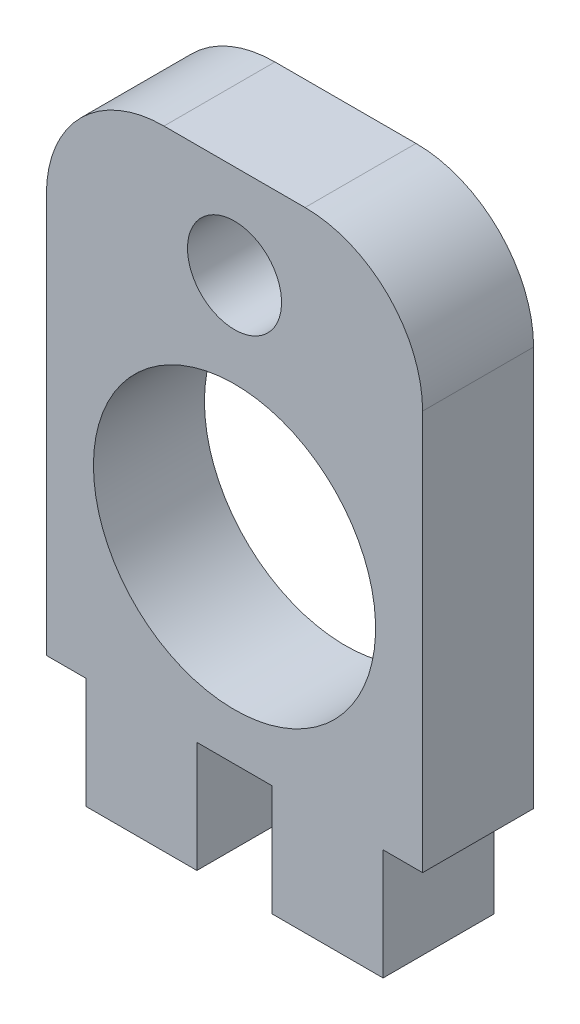
ISO-10303-21;
HEADER;
FILE_DESCRIPTION(('STEP AP214'),'2;1');
FILE_NAME('part.step','',(''),(''),'','','');
FILE_SCHEMA(('AUTOMOTIVE_DESIGN { 1 0 10303 214 1 1 1 1 }'));
ENDSEC;
DATA;
#1=APPLICATION_CONTEXT('core data for automotive mechanical design processes');
#2=APPLICATION_PROTOCOL_DEFINITION('international standard','automotive_design',2000,#1);
#3=PRODUCT_CONTEXT('',#1,'mechanical');
#4=PRODUCT('Part','Part','',(#3));
#5=PRODUCT_RELATED_PRODUCT_CATEGORY('part','',(#4));
#6=PRODUCT_DEFINITION_FORMATION('','',#4);
#7=PRODUCT_DEFINITION_CONTEXT('part definition',#1,'design');
#8=PRODUCT_DEFINITION('design','',#6,#7);
#9=PRODUCT_DEFINITION_SHAPE('','',#8);
#10=(LENGTH_UNIT() NAMED_UNIT(*) SI_UNIT(.MILLI.,.METRE.));
#11=(NAMED_UNIT(*) PLANE_ANGLE_UNIT() SI_UNIT($,.RADIAN.));
#12=(NAMED_UNIT(*) SI_UNIT($,.STERADIAN.) SOLID_ANGLE_UNIT());
#13=UNCERTAINTY_MEASURE_WITH_UNIT(LENGTH_MEASURE(1.E-05),#10,'distance_accuracy_value','');
#14=(GEOMETRIC_REPRESENTATION_CONTEXT(3) GLOBAL_UNCERTAINTY_ASSIGNED_CONTEXT((#13)) GLOBAL_UNIT_ASSIGNED_CONTEXT((#10,
#11,#12)) REPRESENTATION_CONTEXT('',''));
#15=CARTESIAN_POINT('',(0.,0.,0.));
#16=DIRECTION('',(0.,0.,1.));
#17=DIRECTION('',(1.,0.,0.));
#18=AXIS2_PLACEMENT_3D('',#15,#16,#17);
#19=CARTESIAN_POINT('',(0.,0.,2.9972));
#20=DIRECTION('',(0.,0.,1.));
#21=DIRECTION('',(1.,0.,0.));
#22=AXIS2_PLACEMENT_3D('',#19,#20,#21);
#23=PLANE('',#22);
#24=CARTESIAN_POINT('',(5.08,5.08,2.9972));
#25=DIRECTION('',(0.,0.,1.));
#26=DIRECTION('',(1.,0.,0.));
#27=AXIS2_PLACEMENT_3D('',#24,#25,#26);
#28=CIRCLE('',#27,3.81);
#29=CARTESIAN_POINT('',(1.27,5.08,2.9972));
#30=VERTEX_POINT('',#29);
#31=EDGE_CURVE('E263',#30,#30,#28,.T.);
#32=ORIENTED_EDGE('',*,*,#31,.F.);
#33=EDGE_LOOP('',(#32));
#34=FACE_BOUND('',#33,.T.);
#35=DIRECTION('',(-1.,0.,0.));
#36=VECTOR('',#35,1.);
#37=CARTESIAN_POINT('',(10.16,13.97,2.9972));
#38=LINE('',#37,#36);
#39=CARTESIAN_POINT('',(6.985,13.97,2.9972));
#40=VERTEX_POINT('',#39);
#41=CARTESIAN_POINT('',(3.175,13.97,2.9972));
#42=VERTEX_POINT('',#41);
#43=EDGE_CURVE('E177',#40,#42,#38,.T.);
#44=ORIENTED_EDGE('',*,*,#43,.T.);
#45=CARTESIAN_POINT('',(3.175,10.795,2.9972));
#46=DIRECTION('',(0.,0.,1.));
#47=DIRECTION('',(1.,0.,0.));
#48=AXIS2_PLACEMENT_3D('',#45,#46,#47);
#49=CIRCLE('',#48,3.175);
#50=CARTESIAN_POINT('',(0.,10.795,2.9972));
#51=VERTEX_POINT('',#50);
#52=EDGE_CURVE('E41',#42,#51,#49,.T.);
#53=ORIENTED_EDGE('',*,*,#52,.T.);
#54=DIRECTION('',(0.,-1.,0.));
#55=VECTOR('',#54,1.);
#56=CARTESIAN_POINT('',(0.,13.97,2.9972));
#57=LINE('',#56,#55);
#58=CARTESIAN_POINT('',(0.,0.,2.9972));
#59=VERTEX_POINT('',#58);
#60=EDGE_CURVE('E135',#51,#59,#57,.T.);
#61=ORIENTED_EDGE('',*,*,#60,.T.);
#62=DIRECTION('',(1.,0.,0.));
#63=VECTOR('',#62,1.);
#64=CARTESIAN_POINT('',(0.,0.,2.9972));
#65=LINE('',#64,#63);
#66=CARTESIAN_POINT('',(1.0668,0.,2.9972));
#67=VERTEX_POINT('',#66);
#68=EDGE_CURVE('E138',#59,#67,#65,.T.);
#69=ORIENTED_EDGE('',*,*,#68,.T.);
#70=DIRECTION('',(0.,-1.,0.));
#71=VECTOR('',#70,1.);
#72=CARTESIAN_POINT('',(1.0668,0.,2.9972));
#73=LINE('',#72,#71);
#74=CARTESIAN_POINT('',(1.0668,-2.9972,2.9972));
#75=VERTEX_POINT('',#74);
#76=EDGE_CURVE('E154',#67,#75,#73,.T.);
#77=ORIENTED_EDGE('',*,*,#76,.T.);
#78=DIRECTION('',(1.,0.,0.));
#79=VECTOR('',#78,1.);
#80=CARTESIAN_POINT('',(1.0668,-2.9972,2.9972));
#81=LINE('',#80,#79);
#82=CARTESIAN_POINT('',(4.064,-2.9972,2.9972));
#83=VERTEX_POINT('',#82);
#84=EDGE_CURVE('E227',#75,#83,#81,.T.);
#85=ORIENTED_EDGE('',*,*,#84,.T.);
#86=DIRECTION('',(0.,1.,0.));
#87=VECTOR('',#86,1.);
#88=CARTESIAN_POINT('',(4.064,-2.9972,2.9972));
#89=LINE('',#88,#87);
#90=CARTESIAN_POINT('',(4.064,0.,2.9972));
#91=VERTEX_POINT('',#90);
#92=EDGE_CURVE('E266',#83,#91,#89,.T.);
#93=ORIENTED_EDGE('',*,*,#92,.T.);
#94=DIRECTION('',(1.,0.,0.));
#95=VECTOR('',#94,1.);
#96=CARTESIAN_POINT('',(4.064,0.,2.9972));
#97=LINE('',#96,#95);
#98=CARTESIAN_POINT('',(6.096,0.,2.9972));
#99=VERTEX_POINT('',#98);
#100=EDGE_CURVE('E270',#91,#99,#97,.T.);
#101=ORIENTED_EDGE('',*,*,#100,.T.);
#102=DIRECTION('',(0.,-1.,0.));
#103=VECTOR('',#102,1.);
#104=CARTESIAN_POINT('',(6.096,0.,2.9972));
#105=LINE('',#104,#103);
#106=CARTESIAN_POINT('',(6.096,-2.9972,2.9972));
#107=VERTEX_POINT('',#106);
#108=EDGE_CURVE('E272',#99,#107,#105,.T.);
#109=ORIENTED_EDGE('',*,*,#108,.T.);
#110=DIRECTION('',(1.,0.,0.));
#111=VECTOR('',#110,1.);
#112=CARTESIAN_POINT('',(6.096,-2.9972,2.9972));
#113=LINE('',#112,#111);
#114=CARTESIAN_POINT('',(9.0932,-2.9972,2.9972));
#115=VERTEX_POINT('',#114);
#116=EDGE_CURVE('E259',#107,#115,#113,.T.);
#117=ORIENTED_EDGE('',*,*,#116,.T.);
#118=DIRECTION('',(0.,1.,0.));
#119=VECTOR('',#118,1.);
#120=CARTESIAN_POINT('',(9.0932,-2.9972,2.9972));
#121=LINE('',#120,#119);
#122=CARTESIAN_POINT('',(9.0932,0.,2.9972));
#123=VERTEX_POINT('',#122);
#124=EDGE_CURVE('E256',#115,#123,#121,.T.);
#125=ORIENTED_EDGE('',*,*,#124,.T.);
#126=DIRECTION('',(1.,0.,0.));
#127=VECTOR('',#126,1.);
#128=CARTESIAN_POINT('',(9.0932,0.,2.9972));
#129=LINE('',#128,#127);
#130=CARTESIAN_POINT('',(10.16,0.,2.9972));
#131=VERTEX_POINT('',#130);
#132=EDGE_CURVE('E255',#123,#131,#129,.T.);
#133=ORIENTED_EDGE('',*,*,#132,.T.);
#134=DIRECTION('',(0.,1.,0.));
#135=VECTOR('',#134,1.);
#136=CARTESIAN_POINT('',(10.16,0.,2.9972));
#137=LINE('',#136,#135);
#138=CARTESIAN_POINT('',(10.16,10.795,2.9972));
#139=VERTEX_POINT('',#138);
#140=EDGE_CURVE('E178',#131,#139,#137,.T.);
#141=ORIENTED_EDGE('',*,*,#140,.T.);
#142=CARTESIAN_POINT('',(6.985,10.795,2.9972));
#143=DIRECTION('',(0.,0.,1.));
#144=DIRECTION('',(1.,0.,0.));
#145=AXIS2_PLACEMENT_3D('',#142,#143,#144);
#146=CIRCLE('',#145,3.175);
#147=EDGE_CURVE('E175',#139,#40,#146,.T.);
#148=ORIENTED_EDGE('',*,*,#147,.T.);
#149=EDGE_LOOP('',(#44,#53,#61,#69,#77,#85,#93,#101,#109,#117,#125,#133,#141,#148));
#150=FACE_BOUND('',#149,.T.);
#151=CARTESIAN_POINT('',(5.08,11.43,2.9972));
#152=DIRECTION('',(0.,0.,1.));
#153=DIRECTION('',(1.,0.,0.));
#154=AXIS2_PLACEMENT_3D('',#151,#152,#153);
#155=CIRCLE('',#154,1.27);
#156=CARTESIAN_POINT('',(3.81,11.43,2.9972));
#157=VERTEX_POINT('',#156);
#158=EDGE_CURVE('E443',#157,#157,#155,.T.);
#159=ORIENTED_EDGE('',*,*,#158,.F.);
#160=EDGE_LOOP('',(#159));
#161=FACE_BOUND('',#160,.T.);
#162=ADVANCED_FACE('F33',(#34,#150,#161),#23,.T.);
#163=CARTESIAN_POINT('',(0.,0.,0.));
#164=DIRECTION('',(0.,0.,1.));
#165=DIRECTION('',(1.,0.,0.));
#166=AXIS2_PLACEMENT_3D('',#163,#164,#165);
#167=PLANE('',#166);
#168=CARTESIAN_POINT('',(5.08,5.08,0.));
#169=DIRECTION('',(0.,0.,1.));
#170=DIRECTION('',(1.,0.,0.));
#171=AXIS2_PLACEMENT_3D('',#168,#169,#170);
#172=CIRCLE('',#171,3.81);
#173=CARTESIAN_POINT('',(1.27,5.08,0.));
#174=VERTEX_POINT('',#173);
#175=EDGE_CURVE('E448',#174,#174,#172,.T.);
#176=ORIENTED_EDGE('',*,*,#175,.T.);
#177=EDGE_LOOP('',(#176));
#178=FACE_BOUND('',#177,.T.);
#179=DIRECTION('',(0.,-1.,0.));
#180=VECTOR('',#179,1.);
#181=CARTESIAN_POINT('',(0.,13.97,0.));
#182=LINE('',#181,#180);
#183=CARTESIAN_POINT('',(0.,10.795,0.));
#184=VERTEX_POINT('',#183);
#185=CARTESIAN_POINT('',(0.,0.,0.));
#186=VERTEX_POINT('',#185);
#187=EDGE_CURVE('E158',#184,#186,#182,.T.);
#188=ORIENTED_EDGE('',*,*,#187,.F.);
#189=CARTESIAN_POINT('',(3.175,10.795,0.));
#190=DIRECTION('',(0.,0.,1.));
#191=DIRECTION('',(1.,0.,0.));
#192=AXIS2_PLACEMENT_3D('',#189,#190,#191);
#193=CIRCLE('',#192,3.175);
#194=CARTESIAN_POINT('',(3.175,13.97,0.));
#195=VERTEX_POINT('',#194);
#196=EDGE_CURVE('E169',#184,#195,#193,.F.);
#197=ORIENTED_EDGE('',*,*,#196,.T.);
#198=DIRECTION('',(-1.,0.,0.));
#199=VECTOR('',#198,1.);
#200=CARTESIAN_POINT('',(10.16,13.97,0.));
#201=LINE('',#200,#199);
#202=CARTESIAN_POINT('',(6.985,13.97,0.));
#203=VERTEX_POINT('',#202);
#204=EDGE_CURVE('E145',#203,#195,#201,.T.);
#205=ORIENTED_EDGE('',*,*,#204,.F.);
#206=CARTESIAN_POINT('',(6.985,10.795,0.));
#207=DIRECTION('',(0.,0.,1.));
#208=DIRECTION('',(1.,0.,0.));
#209=AXIS2_PLACEMENT_3D('',#206,#207,#208);
#210=CIRCLE('',#209,3.175);
#211=CARTESIAN_POINT('',(10.16,10.795,0.));
#212=VERTEX_POINT('',#211);
#213=EDGE_CURVE('E162',#203,#212,#210,.F.);
#214=ORIENTED_EDGE('',*,*,#213,.T.);
#215=DIRECTION('',(0.,1.,0.));
#216=VECTOR('',#215,1.);
#217=CARTESIAN_POINT('',(10.16,0.,0.));
#218=LINE('',#217,#216);
#219=CARTESIAN_POINT('',(10.16,0.,0.));
#220=VERTEX_POINT('',#219);
#221=EDGE_CURVE('E190',#220,#212,#218,.T.);
#222=ORIENTED_EDGE('',*,*,#221,.F.);
#223=DIRECTION('',(1.,0.,0.));
#224=VECTOR('',#223,1.);
#225=CARTESIAN_POINT('',(9.0932,0.,0.));
#226=LINE('',#225,#224);
#227=CARTESIAN_POINT('',(9.0932,0.,0.));
#228=VERTEX_POINT('',#227);
#229=EDGE_CURVE('E194',#228,#220,#226,.T.);
#230=ORIENTED_EDGE('',*,*,#229,.F.);
#231=DIRECTION('',(0.,1.,0.));
#232=VECTOR('',#231,1.);
#233=CARTESIAN_POINT('',(9.0932,-2.9972,0.));
#234=LINE('',#233,#232);
#235=CARTESIAN_POINT('',(9.0932,-2.9972,0.));
#236=VERTEX_POINT('',#235);
#237=EDGE_CURVE('E197',#236,#228,#234,.T.);
#238=ORIENTED_EDGE('',*,*,#237,.F.);
#239=DIRECTION('',(1.,0.,0.));
#240=VECTOR('',#239,1.);
#241=CARTESIAN_POINT('',(6.096,-2.9972,0.));
#242=LINE('',#241,#240);
#243=CARTESIAN_POINT('',(6.096,-2.9972,0.));
#244=VERTEX_POINT('',#243);
#245=EDGE_CURVE('E244',#244,#236,#242,.T.);
#246=ORIENTED_EDGE('',*,*,#245,.F.);
#247=DIRECTION('',(0.,-1.,0.));
#248=VECTOR('',#247,1.);
#249=CARTESIAN_POINT('',(6.096,0.,0.));
#250=LINE('',#249,#248);
#251=CARTESIAN_POINT('',(6.096,0.,0.));
#252=VERTEX_POINT('',#251);
#253=EDGE_CURVE('E242',#252,#244,#250,.T.);
#254=ORIENTED_EDGE('',*,*,#253,.F.);
#255=DIRECTION('',(1.,0.,0.));
#256=VECTOR('',#255,1.);
#257=CARTESIAN_POINT('',(4.064,0.,0.));
#258=LINE('',#257,#256);
#259=CARTESIAN_POINT('',(4.064,0.,0.));
#260=VERTEX_POINT('',#259);
#261=EDGE_CURVE('E235',#260,#252,#258,.T.);
#262=ORIENTED_EDGE('',*,*,#261,.F.);
#263=DIRECTION('',(0.,1.,0.));
#264=VECTOR('',#263,1.);
#265=CARTESIAN_POINT('',(4.064,-2.9972,0.));
#266=LINE('',#265,#264);
#267=CARTESIAN_POINT('',(4.064,-2.9972,0.));
#268=VERTEX_POINT('',#267);
#269=EDGE_CURVE('E233',#268,#260,#266,.T.);
#270=ORIENTED_EDGE('',*,*,#269,.F.);
#271=DIRECTION('',(1.,0.,0.));
#272=VECTOR('',#271,1.);
#273=CARTESIAN_POINT('',(1.0668,-2.9972,0.));
#274=LINE('',#273,#272);
#275=CARTESIAN_POINT('',(1.0668,-2.9972,0.));
#276=VERTEX_POINT('',#275);
#277=EDGE_CURVE('E226',#276,#268,#274,.T.);
#278=ORIENTED_EDGE('',*,*,#277,.F.);
#279=DIRECTION('',(0.,-1.,0.));
#280=VECTOR('',#279,1.);
#281=CARTESIAN_POINT('',(1.0668,0.,0.));
#282=LINE('',#281,#280);
#283=CARTESIAN_POINT('',(1.0668,0.,0.));
#284=VERTEX_POINT('',#283);
#285=EDGE_CURVE('E231',#284,#276,#282,.T.);
#286=ORIENTED_EDGE('',*,*,#285,.F.);
#287=DIRECTION('',(1.,0.,0.));
#288=VECTOR('',#287,1.);
#289=CARTESIAN_POINT('',(0.,0.,0.));
#290=LINE('',#289,#288);
#291=EDGE_CURVE('E237',#186,#284,#290,.T.);
#292=ORIENTED_EDGE('',*,*,#291,.F.);
#293=EDGE_LOOP('',(#188,#197,#205,#214,#222,#230,#238,#246,#254,#262,#270,#278,#286,#292));
#294=FACE_BOUND('',#293,.T.);
#295=CARTESIAN_POINT('',(5.08,11.43,0.));
#296=DIRECTION('',(0.,0.,1.));
#297=DIRECTION('',(1.,0.,0.));
#298=AXIS2_PLACEMENT_3D('',#295,#296,#297);
#299=CIRCLE('',#298,1.27);
#300=CARTESIAN_POINT('',(3.81,11.43,0.));
#301=VERTEX_POINT('',#300);
#302=EDGE_CURVE('E446',#301,#301,#299,.T.);
#303=ORIENTED_EDGE('',*,*,#302,.T.);
#304=EDGE_LOOP('',(#303));
#305=FACE_BOUND('',#304,.T.);
#306=ADVANCED_FACE('F187',(#178,#294,#305),#167,.F.);
#307=CARTESIAN_POINT('',(0.,13.97,2.9972));
#308=DIRECTION('',(1.,0.,0.));
#309=DIRECTION('',(0.,0.,-1.));
#310=AXIS2_PLACEMENT_3D('',#307,#308,#309);
#311=PLANE('',#310);
#312=ORIENTED_EDGE('',*,*,#60,.F.);
#313=DIRECTION('',(0.,0.,-1.));
#314=VECTOR('',#313,1.);
#315=CARTESIAN_POINT('',(0.,10.795,2.9972));
#316=LINE('',#315,#314);
#317=EDGE_CURVE('E160',#51,#184,#316,.T.);
#318=ORIENTED_EDGE('',*,*,#317,.T.);
#319=ORIENTED_EDGE('',*,*,#187,.T.);
#320=DIRECTION('',(0.,0.,-1.));
#321=VECTOR('',#320,1.);
#322=CARTESIAN_POINT('',(0.,0.,2.9972));
#323=LINE('',#322,#321);
#324=EDGE_CURVE('E150',#59,#186,#323,.T.);
#325=ORIENTED_EDGE('',*,*,#324,.F.);
#326=EDGE_LOOP('',(#312,#318,#319,#325));
#327=FACE_BOUND('',#326,.T.);
#328=ADVANCED_FACE('F156',(#327),#311,.F.);
#329=CARTESIAN_POINT('',(0.,0.,2.9972));
#330=DIRECTION('',(0.,1.,0.));
#331=DIRECTION('',(0.,0.,1.));
#332=AXIS2_PLACEMENT_3D('',#329,#330,#331);
#333=PLANE('',#332);
#334=ORIENTED_EDGE('',*,*,#291,.T.);
#335=DIRECTION('',(0.,0.,-1.));
#336=VECTOR('',#335,1.);
#337=CARTESIAN_POINT('',(1.0668,0.,2.9972));
#338=LINE('',#337,#336);
#339=EDGE_CURVE('E152',#67,#284,#338,.T.);
#340=ORIENTED_EDGE('',*,*,#339,.F.);
#341=ORIENTED_EDGE('',*,*,#68,.F.);
#342=ORIENTED_EDGE('',*,*,#324,.T.);
#343=EDGE_LOOP('',(#334,#340,#341,#342));
#344=FACE_BOUND('',#343,.T.);
#345=ADVANCED_FACE('F149',(#344),#333,.F.);
#346=CARTESIAN_POINT('',(1.0668,0.,2.9972));
#347=DIRECTION('',(1.,0.,0.));
#348=DIRECTION('',(0.,0.,-1.));
#349=AXIS2_PLACEMENT_3D('',#346,#347,#348);
#350=PLANE('',#349);
#351=ORIENTED_EDGE('',*,*,#285,.T.);
#352=DIRECTION('',(0.,0.,-1.));
#353=VECTOR('',#352,1.);
#354=CARTESIAN_POINT('',(1.0668,-2.9972,2.9972));
#355=LINE('',#354,#353);
#356=EDGE_CURVE('E164',#75,#276,#355,.T.);
#357=ORIENTED_EDGE('',*,*,#356,.F.);
#358=ORIENTED_EDGE('',*,*,#76,.F.);
#359=ORIENTED_EDGE('',*,*,#339,.T.);
#360=EDGE_LOOP('',(#351,#357,#358,#359));
#361=FACE_BOUND('',#360,.T.);
#362=ADVANCED_FACE('F264',(#361),#350,.F.);
#363=CARTESIAN_POINT('',(1.0668,-2.9972,2.9972));
#364=DIRECTION('',(0.,1.,0.));
#365=DIRECTION('',(0.,0.,1.));
#366=AXIS2_PLACEMENT_3D('',#363,#364,#365);
#367=PLANE('',#366);
#368=ORIENTED_EDGE('',*,*,#277,.T.);
#369=DIRECTION('',(0.,0.,-1.));
#370=VECTOR('',#369,1.);
#371=CARTESIAN_POINT('',(4.064,-2.9972,2.9972));
#372=LINE('',#371,#370);
#373=EDGE_CURVE('E217',#83,#268,#372,.T.);
#374=ORIENTED_EDGE('',*,*,#373,.F.);
#375=ORIENTED_EDGE('',*,*,#84,.F.);
#376=ORIENTED_EDGE('',*,*,#356,.T.);
#377=EDGE_LOOP('',(#368,#374,#375,#376));
#378=FACE_BOUND('',#377,.T.);
#379=ADVANCED_FACE('F224',(#378),#367,.F.);
#380=CARTESIAN_POINT('',(4.064,-2.9972,2.9972));
#381=DIRECTION('',(-1.,0.,0.));
#382=DIRECTION('',(0.,0.,1.));
#383=AXIS2_PLACEMENT_3D('',#380,#381,#382);
#384=PLANE('',#383);
#385=ORIENTED_EDGE('',*,*,#269,.T.);
#386=DIRECTION('',(0.,0.,-1.));
#387=VECTOR('',#386,1.);
#388=CARTESIAN_POINT('',(4.064,0.,2.9972));
#389=LINE('',#388,#387);
#390=EDGE_CURVE('E214',#91,#260,#389,.T.);
#391=ORIENTED_EDGE('',*,*,#390,.F.);
#392=ORIENTED_EDGE('',*,*,#92,.F.);
#393=ORIENTED_EDGE('',*,*,#373,.T.);
#394=EDGE_LOOP('',(#385,#391,#392,#393));
#395=FACE_BOUND('',#394,.T.);
#396=ADVANCED_FACE('F288',(#395),#384,.F.);
#397=CARTESIAN_POINT('',(4.064,0.,2.9972));
#398=DIRECTION('',(0.,1.,0.));
#399=DIRECTION('',(0.,0.,1.));
#400=AXIS2_PLACEMENT_3D('',#397,#398,#399);
#401=PLANE('',#400);
#402=ORIENTED_EDGE('',*,*,#261,.T.);
#403=DIRECTION('',(0.,0.,-1.));
#404=VECTOR('',#403,1.);
#405=CARTESIAN_POINT('',(6.096,0.,2.9972));
#406=LINE('',#405,#404);
#407=EDGE_CURVE('E211',#99,#252,#406,.T.);
#408=ORIENTED_EDGE('',*,*,#407,.F.);
#409=ORIENTED_EDGE('',*,*,#100,.F.);
#410=ORIENTED_EDGE('',*,*,#390,.T.);
#411=EDGE_LOOP('',(#402,#408,#409,#410));
#412=FACE_BOUND('',#411,.T.);
#413=ADVANCED_FACE('F284',(#412),#401,.F.);
#414=CARTESIAN_POINT('',(6.096,0.,2.9972));
#415=DIRECTION('',(1.,0.,0.));
#416=DIRECTION('',(0.,0.,-1.));
#417=AXIS2_PLACEMENT_3D('',#414,#415,#416);
#418=PLANE('',#417);
#419=ORIENTED_EDGE('',*,*,#253,.T.);
#420=DIRECTION('',(0.,0.,-1.));
#421=VECTOR('',#420,1.);
#422=CARTESIAN_POINT('',(6.096,-2.9972,2.9972));
#423=LINE('',#422,#421);
#424=EDGE_CURVE('E208',#107,#244,#423,.T.);
#425=ORIENTED_EDGE('',*,*,#424,.F.);
#426=ORIENTED_EDGE('',*,*,#108,.F.);
#427=ORIENTED_EDGE('',*,*,#407,.T.);
#428=EDGE_LOOP('',(#419,#425,#426,#427));
#429=FACE_BOUND('',#428,.T.);
#430=ADVANCED_FACE('F280',(#429),#418,.F.);
#431=CARTESIAN_POINT('',(6.096,-2.9972,2.9972));
#432=DIRECTION('',(0.,1.,0.));
#433=DIRECTION('',(0.,0.,1.));
#434=AXIS2_PLACEMENT_3D('',#431,#432,#433);
#435=PLANE('',#434);
#436=ORIENTED_EDGE('',*,*,#245,.T.);
#437=DIRECTION('',(0.,0.,-1.));
#438=VECTOR('',#437,1.);
#439=CARTESIAN_POINT('',(9.0932,-2.9972,2.9972));
#440=LINE('',#439,#438);
#441=EDGE_CURVE('E205',#115,#236,#440,.T.);
#442=ORIENTED_EDGE('',*,*,#441,.F.);
#443=ORIENTED_EDGE('',*,*,#116,.F.);
#444=ORIENTED_EDGE('',*,*,#424,.T.);
#445=EDGE_LOOP('',(#436,#442,#443,#444));
#446=FACE_BOUND('',#445,.T.);
#447=ADVANCED_FACE('F277',(#446),#435,.F.);
#448=CARTESIAN_POINT('',(9.0932,-2.9972,2.9972));
#449=DIRECTION('',(-1.,0.,0.));
#450=DIRECTION('',(0.,-1.,0.));
#451=AXIS2_PLACEMENT_3D('',#448,#449,#450);
#452=PLANE('',#451);
#453=ORIENTED_EDGE('',*,*,#237,.T.);
#454=DIRECTION('',(0.,0.,-1.));
#455=VECTOR('',#454,1.);
#456=CARTESIAN_POINT('',(9.0932,0.,2.9972));
#457=LINE('',#456,#455);
#458=EDGE_CURVE('E202',#123,#228,#457,.T.);
#459=ORIENTED_EDGE('',*,*,#458,.F.);
#460=ORIENTED_EDGE('',*,*,#124,.F.);
#461=ORIENTED_EDGE('',*,*,#441,.T.);
#462=EDGE_LOOP('',(#453,#459,#460,#461));
#463=FACE_BOUND('',#462,.T.);
#464=ADVANCED_FACE('F248',(#463),#452,.F.);
#465=CARTESIAN_POINT('',(9.0932,0.,2.9972));
#466=DIRECTION('',(0.,1.,0.));
#467=DIRECTION('',(0.,0.,1.));
#468=AXIS2_PLACEMENT_3D('',#465,#466,#467);
#469=PLANE('',#468);
#470=ORIENTED_EDGE('',*,*,#229,.T.);
#471=DIRECTION('',(0.,0.,-1.));
#472=VECTOR('',#471,1.);
#473=CARTESIAN_POINT('',(10.16,0.,2.9972));
#474=LINE('',#473,#472);
#475=EDGE_CURVE('E183',#131,#220,#474,.T.);
#476=ORIENTED_EDGE('',*,*,#475,.F.);
#477=ORIENTED_EDGE('',*,*,#132,.F.);
#478=ORIENTED_EDGE('',*,*,#458,.T.);
#479=EDGE_LOOP('',(#470,#476,#477,#478));
#480=FACE_BOUND('',#479,.T.);
#481=ADVANCED_FACE('F254',(#480),#469,.F.);
#482=CARTESIAN_POINT('',(10.16,0.,2.9972));
#483=DIRECTION('',(-1.,0.,0.));
#484=DIRECTION('',(0.,-1.,0.));
#485=AXIS2_PLACEMENT_3D('',#482,#483,#484);
#486=PLANE('',#485);
#487=ORIENTED_EDGE('',*,*,#221,.T.);
#488=DIRECTION('',(0.,0.,-1.));
#489=VECTOR('',#488,1.);
#490=CARTESIAN_POINT('',(10.16,10.795,2.9972));
#491=LINE('',#490,#489);
#492=EDGE_CURVE('E11',#212,#139,#491,.F.);
#493=ORIENTED_EDGE('',*,*,#492,.T.);
#494=ORIENTED_EDGE('',*,*,#140,.F.);
#495=ORIENTED_EDGE('',*,*,#475,.T.);
#496=EDGE_LOOP('',(#487,#493,#494,#495));
#497=FACE_BOUND('',#496,.T.);
#498=ADVANCED_FACE('F192',(#497),#486,.F.);
#499=CARTESIAN_POINT('',(10.16,13.97,2.9972));
#500=DIRECTION('',(0.,-1.,0.));
#501=DIRECTION('',(1.,0.,0.));
#502=AXIS2_PLACEMENT_3D('',#499,#500,#501);
#503=PLANE('',#502);
#504=ORIENTED_EDGE('',*,*,#204,.T.);
#505=DIRECTION('',(0.,0.,-1.));
#506=VECTOR('',#505,1.);
#507=CARTESIAN_POINT('',(3.175,13.97,2.9972));
#508=LINE('',#507,#506);
#509=EDGE_CURVE('E54',#195,#42,#508,.F.);
#510=ORIENTED_EDGE('',*,*,#509,.T.);
#511=ORIENTED_EDGE('',*,*,#43,.F.);
#512=DIRECTION('',(0.,0.,-1.));
#513=VECTOR('',#512,1.);
#514=CARTESIAN_POINT('',(6.985,13.97,2.9972));
#515=LINE('',#514,#513);
#516=EDGE_CURVE('E171',#40,#203,#515,.T.);
#517=ORIENTED_EDGE('',*,*,#516,.T.);
#518=EDGE_LOOP('',(#504,#510,#511,#517));
#519=FACE_BOUND('',#518,.T.);
#520=ADVANCED_FACE('F181',(#519),#503,.F.);
#521=CARTESIAN_POINT('',(5.08,5.08,2.9972));
#522=DIRECTION('',(0.,0.,-1.));
#523=DIRECTION('',(-1.,0.,0.));
#524=AXIS2_PLACEMENT_3D('',#521,#522,#523);
#525=CYLINDRICAL_SURFACE('',#524,3.81);
#526=CARTESIAN_POINT('',(1.27,5.08,2.9972));
#527=CARTESIAN_POINT('',(1.27,5.08,2.96597916666667));
#528=CARTESIAN_POINT('',(1.27,5.08,2.93475833333333));
#529=CARTESIAN_POINT('',(1.27,5.08,2.87231666666667));
#530=CARTESIAN_POINT('',(1.27,5.08,2.84109583333333));
#531=CARTESIAN_POINT('',(1.27,5.08,2.77865416666667));
#532=CARTESIAN_POINT('',(1.27,5.08,2.74743333333333));
#533=CARTESIAN_POINT('',(1.27,5.08,2.68499166666667));
#534=CARTESIAN_POINT('',(1.27,5.08,2.65377083333333));
#535=CARTESIAN_POINT('',(1.27,5.08,2.59132916666667));
#536=CARTESIAN_POINT('',(1.27,5.08,2.56010833333333));
#537=CARTESIAN_POINT('',(1.27,5.08,2.49766666666667));
#538=CARTESIAN_POINT('',(1.27,5.08,2.46644583333333));
#539=CARTESIAN_POINT('',(1.27,5.08,2.40400416666667));
#540=CARTESIAN_POINT('',(1.27,5.08,2.37278333333333));
#541=CARTESIAN_POINT('',(1.27,5.08,2.31034166666667));
#542=CARTESIAN_POINT('',(1.27,5.08,2.27912083333333));
#543=CARTESIAN_POINT('',(1.27,5.08,2.21667916666667));
#544=CARTESIAN_POINT('',(1.27,5.08,2.18545833333333));
#545=CARTESIAN_POINT('',(1.27,5.08,2.12301666666667));
#546=CARTESIAN_POINT('',(1.27,5.08,2.09179583333333));
#547=CARTESIAN_POINT('',(1.27,5.08,2.02935416666667));
#548=CARTESIAN_POINT('',(1.27,5.08,1.99813333333333));
#549=CARTESIAN_POINT('',(1.27,5.08,1.93569166666667));
#550=CARTESIAN_POINT('',(1.27,5.08,1.90447083333333));
#551=CARTESIAN_POINT('',(1.27,5.08,1.84202916666667));
#552=CARTESIAN_POINT('',(1.27,5.08,1.81080833333333));
#553=CARTESIAN_POINT('',(1.27,5.08,1.74836666666667));
#554=CARTESIAN_POINT('',(1.27,5.08,1.71714583333333));
#555=CARTESIAN_POINT('',(1.27,5.08,1.65470416666667));
#556=CARTESIAN_POINT('',(1.27,5.08,1.62348333333333));
#557=CARTESIAN_POINT('',(1.27,5.08,1.56104166666667));
#558=CARTESIAN_POINT('',(1.27,5.08,1.52982083333333));
#559=CARTESIAN_POINT('',(1.27,5.08,1.46737916666667));
#560=CARTESIAN_POINT('',(1.27,5.08,1.43615833333333));
#561=CARTESIAN_POINT('',(1.27,5.08,1.37371666666667));
#562=CARTESIAN_POINT('',(1.27,5.08,1.34249583333333));
#563=CARTESIAN_POINT('',(1.27,5.08,1.28005416666667));
#564=CARTESIAN_POINT('',(1.27,5.08,1.24883333333333));
#565=CARTESIAN_POINT('',(1.27,5.08,1.18639166666667));
#566=CARTESIAN_POINT('',(1.27,5.08,1.15517083333333));
#567=CARTESIAN_POINT('',(1.27,5.08,1.09272916666667));
#568=CARTESIAN_POINT('',(1.27,5.08,1.06150833333333));
#569=CARTESIAN_POINT('',(1.27,5.08,0.999066666666667));
#570=CARTESIAN_POINT('',(1.27,5.08,0.967845833333333));
#571=CARTESIAN_POINT('',(1.27,5.08,0.905404166666667));
#572=CARTESIAN_POINT('',(1.27,5.08,0.874183333333333));
#573=CARTESIAN_POINT('',(1.27,5.08,0.811741666666667));
#574=CARTESIAN_POINT('',(1.27,5.08,0.780520833333333));
#575=CARTESIAN_POINT('',(1.27,5.08,0.718079166666667));
#576=CARTESIAN_POINT('',(1.27,5.08,0.686858333333333));
#577=CARTESIAN_POINT('',(1.27,5.08,0.624416666666667));
#578=CARTESIAN_POINT('',(1.27,5.08,0.593195833333333));
#579=CARTESIAN_POINT('',(1.27,5.08,0.530754166666667));
#580=CARTESIAN_POINT('',(1.27,5.08,0.499533333333333));
#581=CARTESIAN_POINT('',(1.27,5.08,0.437091666666667));
#582=CARTESIAN_POINT('',(1.27,5.08,0.405870833333333));
#583=CARTESIAN_POINT('',(1.27,5.08,0.343429166666667));
#584=CARTESIAN_POINT('',(1.27,5.08,0.312208333333333));
#585=CARTESIAN_POINT('',(1.27,5.08,0.249766666666667));
#586=CARTESIAN_POINT('',(1.27,5.08,0.218545833333333));
#587=CARTESIAN_POINT('',(1.27,5.08,0.156104166666667));
#588=CARTESIAN_POINT('',(1.27,5.08,0.124883333333333));
#589=CARTESIAN_POINT('',(1.27,5.08,0.0624416666666668));
#590=CARTESIAN_POINT('',(1.27,5.08,0.0312208333333333));
#591=CARTESIAN_POINT('',(1.27,5.08,0.));
#592=B_SPLINE_CURVE_WITH_KNOTS('',3,(#526,#527,#528,#529,#530,#531,#532,#533,#534,#535,#536,
#537,#538,#539,#540,#541,#542,#543,#544,#545,#546,#547,#548,#549,#550,#551,#552,#553,#554,#555,
#556,#557,#558,#559,#560,#561,#562,#563,#564,#565,#566,#567,#568,#569,#570,#571,#572,#573,#574,
#575,#576,#577,#578,#579,#580,#581,#582,#583,#584,#585,#586,#587,#588,#589,#590,#591),
.UNSPECIFIED.,.F.,.F.,(4,2,2,2,2,2,2,2,2,2,2,2,2,2,2,2,2,2,2,2,2,2,2,2,2,2,2,2,2,2,2,2,4),(0.,
0.0936624999999997,0.187325,0.2809875,0.37465,0.4683125,0.561975,0.655637499999999,0.7493,
0.8429625,0.936624999999999,1.0302875,1.12395,1.2176125,1.311275,1.4049375,1.4986,1.5922625,
1.685925,1.7795875,1.87325,1.9669125,2.060575,2.1542375,2.2479,2.3415625,2.435225,2.5288875,
2.62255,2.7162125,2.809875,2.9035375,2.9972),.UNSPECIFIED.);
#593=EDGE_CURVE('BSEAM307',#30,#174,#592,.T.);
#594=ORIENTED_EDGE('',*,*,#31,.T.);
#595=ORIENTED_EDGE('',*,*,#175,.F.);
#596=ORIENTED_EDGE('',*,*,#593,.T.);
#597=ORIENTED_EDGE('',*,*,#593,.F.);
#598=EDGE_LOOP('',(#594,#596,#595,#597));
#599=FACE_BOUND('',#598,.T.);
#600=ADVANCED_FACE('F307',(#599),#525,.F.);
#601=CARTESIAN_POINT('',(5.08,11.43,2.9972));
#602=DIRECTION('',(0.,0.,-1.));
#603=DIRECTION('',(-1.,0.,0.));
#604=AXIS2_PLACEMENT_3D('',#601,#602,#603);
#605=CYLINDRICAL_SURFACE('',#604,1.27);
#606=CARTESIAN_POINT('',(3.81,11.43,2.9972));
#607=CARTESIAN_POINT('',(3.81,11.43,2.96597916666667));
#608=CARTESIAN_POINT('',(3.81,11.43,2.93475833333333));
#609=CARTESIAN_POINT('',(3.81,11.43,2.87231666666667));
#610=CARTESIAN_POINT('',(3.81,11.43,2.84109583333333));
#611=CARTESIAN_POINT('',(3.81,11.43,2.77865416666667));
#612=CARTESIAN_POINT('',(3.81,11.43,2.74743333333333));
#613=CARTESIAN_POINT('',(3.81,11.43,2.68499166666667));
#614=CARTESIAN_POINT('',(3.81,11.43,2.65377083333333));
#615=CARTESIAN_POINT('',(3.81,11.43,2.59132916666667));
#616=CARTESIAN_POINT('',(3.81,11.43,2.56010833333333));
#617=CARTESIAN_POINT('',(3.81,11.43,2.49766666666667));
#618=CARTESIAN_POINT('',(3.81,11.43,2.46644583333333));
#619=CARTESIAN_POINT('',(3.81,11.43,2.40400416666667));
#620=CARTESIAN_POINT('',(3.81,11.43,2.37278333333333));
#621=CARTESIAN_POINT('',(3.81,11.43,2.31034166666667));
#622=CARTESIAN_POINT('',(3.81,11.43,2.27912083333333));
#623=CARTESIAN_POINT('',(3.81,11.43,2.21667916666667));
#624=CARTESIAN_POINT('',(3.81,11.43,2.18545833333333));
#625=CARTESIAN_POINT('',(3.81,11.43,2.12301666666667));
#626=CARTESIAN_POINT('',(3.81,11.43,2.09179583333333));
#627=CARTESIAN_POINT('',(3.81,11.43,2.02935416666667));
#628=CARTESIAN_POINT('',(3.81,11.43,1.99813333333333));
#629=CARTESIAN_POINT('',(3.81,11.43,1.93569166666667));
#630=CARTESIAN_POINT('',(3.81,11.43,1.90447083333333));
#631=CARTESIAN_POINT('',(3.81,11.43,1.84202916666667));
#632=CARTESIAN_POINT('',(3.81,11.43,1.81080833333333));
#633=CARTESIAN_POINT('',(3.81,11.43,1.74836666666667));
#634=CARTESIAN_POINT('',(3.81,11.43,1.71714583333333));
#635=CARTESIAN_POINT('',(3.81,11.43,1.65470416666667));
#636=CARTESIAN_POINT('',(3.81,11.43,1.62348333333333));
#637=CARTESIAN_POINT('',(3.81,11.43,1.56104166666667));
#638=CARTESIAN_POINT('',(3.81,11.43,1.52982083333333));
#639=CARTESIAN_POINT('',(3.81,11.43,1.46737916666667));
#640=CARTESIAN_POINT('',(3.81,11.43,1.43615833333333));
#641=CARTESIAN_POINT('',(3.81,11.43,1.37371666666667));
#642=CARTESIAN_POINT('',(3.81,11.43,1.34249583333333));
#643=CARTESIAN_POINT('',(3.81,11.43,1.28005416666667));
#644=CARTESIAN_POINT('',(3.81,11.43,1.24883333333333));
#645=CARTESIAN_POINT('',(3.81,11.43,1.18639166666667));
#646=CARTESIAN_POINT('',(3.81,11.43,1.15517083333333));
#647=CARTESIAN_POINT('',(3.81,11.43,1.09272916666667));
#648=CARTESIAN_POINT('',(3.81,11.43,1.06150833333333));
#649=CARTESIAN_POINT('',(3.81,11.43,0.999066666666667));
#650=CARTESIAN_POINT('',(3.81,11.43,0.967845833333333));
#651=CARTESIAN_POINT('',(3.81,11.43,0.905404166666667));
#652=CARTESIAN_POINT('',(3.81,11.43,0.874183333333333));
#653=CARTESIAN_POINT('',(3.81,11.43,0.811741666666667));
#654=CARTESIAN_POINT('',(3.81,11.43,0.780520833333333));
#655=CARTESIAN_POINT('',(3.81,11.43,0.718079166666667));
#656=CARTESIAN_POINT('',(3.81,11.43,0.686858333333333));
#657=CARTESIAN_POINT('',(3.81,11.43,0.624416666666667));
#658=CARTESIAN_POINT('',(3.81,11.43,0.593195833333333));
#659=CARTESIAN_POINT('',(3.81,11.43,0.530754166666667));
#660=CARTESIAN_POINT('',(3.81,11.43,0.499533333333333));
#661=CARTESIAN_POINT('',(3.81,11.43,0.437091666666667));
#662=CARTESIAN_POINT('',(3.81,11.43,0.405870833333333));
#663=CARTESIAN_POINT('',(3.81,11.43,0.343429166666667));
#664=CARTESIAN_POINT('',(3.81,11.43,0.312208333333333));
#665=CARTESIAN_POINT('',(3.81,11.43,0.249766666666667));
#666=CARTESIAN_POINT('',(3.81,11.43,0.218545833333333));
#667=CARTESIAN_POINT('',(3.81,11.43,0.156104166666667));
#668=CARTESIAN_POINT('',(3.81,11.43,0.124883333333333));
#669=CARTESIAN_POINT('',(3.81,11.43,0.0624416666666668));
#670=CARTESIAN_POINT('',(3.81,11.43,0.0312208333333333));
#671=CARTESIAN_POINT('',(3.81,11.43,0.));
#672=B_SPLINE_CURVE_WITH_KNOTS('',3,(#606,#607,#608,#609,#610,#611,#612,#613,#614,#615,#616,
#617,#618,#619,#620,#621,#622,#623,#624,#625,#626,#627,#628,#629,#630,#631,#632,#633,#634,#635,
#636,#637,#638,#639,#640,#641,#642,#643,#644,#645,#646,#647,#648,#649,#650,#651,#652,#653,#654,
#655,#656,#657,#658,#659,#660,#661,#662,#663,#664,#665,#666,#667,#668,#669,#670,#671),
.UNSPECIFIED.,.F.,.F.,(4,2,2,2,2,2,2,2,2,2,2,2,2,2,2,2,2,2,2,2,2,2,2,2,2,2,2,2,2,2,2,2,4),(0.,
0.0936624999999997,0.187325,0.2809875,0.37465,0.4683125,0.561975,0.655637499999999,0.7493,
0.8429625,0.936624999999999,1.0302875,1.12395,1.2176125,1.311275,1.4049375,1.4986,1.5922625,
1.685925,1.7795875,1.87325,1.9669125,2.060575,2.1542375,2.2479,2.3415625,2.435225,2.5288875,
2.62255,2.7162125,2.809875,2.9035375,2.9972),.UNSPECIFIED.);
#673=EDGE_CURVE('BSEAM353',#157,#301,#672,.T.);
#674=ORIENTED_EDGE('',*,*,#158,.T.);
#675=ORIENTED_EDGE('',*,*,#302,.F.);
#676=ORIENTED_EDGE('',*,*,#673,.T.);
#677=ORIENTED_EDGE('',*,*,#673,.F.);
#678=EDGE_LOOP('',(#674,#676,#675,#677));
#679=FACE_BOUND('',#678,.T.);
#680=ADVANCED_FACE('F353',(#679),#605,.F.);
#681=CARTESIAN_POINT('',(3.175,10.795,2.9972));
#682=DIRECTION('',(0.,0.,-1.));
#683=DIRECTION('',(-1.,0.,0.));
#684=AXIS2_PLACEMENT_3D('',#681,#682,#683);
#685=CYLINDRICAL_SURFACE('',#684,3.175);
#686=ORIENTED_EDGE('',*,*,#52,.F.);
#687=ORIENTED_EDGE('',*,*,#509,.F.);
#688=ORIENTED_EDGE('',*,*,#196,.F.);
#689=ORIENTED_EDGE('',*,*,#317,.F.);
#690=EDGE_LOOP('',(#686,#687,#688,#689));
#691=FACE_BOUND('',#690,.T.);
#692=ADVANCED_FACE('F360',(#691),#685,.T.);
#693=CARTESIAN_POINT('',(6.985,10.795,2.9972));
#694=DIRECTION('',(0.,0.,-1.));
#695=DIRECTION('',(-1.,0.,0.));
#696=AXIS2_PLACEMENT_3D('',#693,#694,#695);
#697=CYLINDRICAL_SURFACE('',#696,3.175);
#698=ORIENTED_EDGE('',*,*,#147,.F.);
#699=ORIENTED_EDGE('',*,*,#492,.F.);
#700=ORIENTED_EDGE('',*,*,#213,.F.);
#701=ORIENTED_EDGE('',*,*,#516,.F.);
#702=EDGE_LOOP('',(#698,#699,#700,#701));
#703=FACE_BOUND('',#702,.T.);
#704=ADVANCED_FACE('F35',(#703),#697,.T.);
#705=CLOSED_SHELL('',(#162,#306,#328,#345,#362,#379,#396,#413,#430,#447,#464,#481,#498,#520,
#600,#680,#692,#704));
#706=MANIFOLD_SOLID_BREP('B2',#705);
#707=ADVANCED_BREP_SHAPE_REPRESENTATION('',(#18,#706),#14);
#708=SHAPE_DEFINITION_REPRESENTATION(#9,#707);
ENDSEC;
END-ISO-10303-21;
